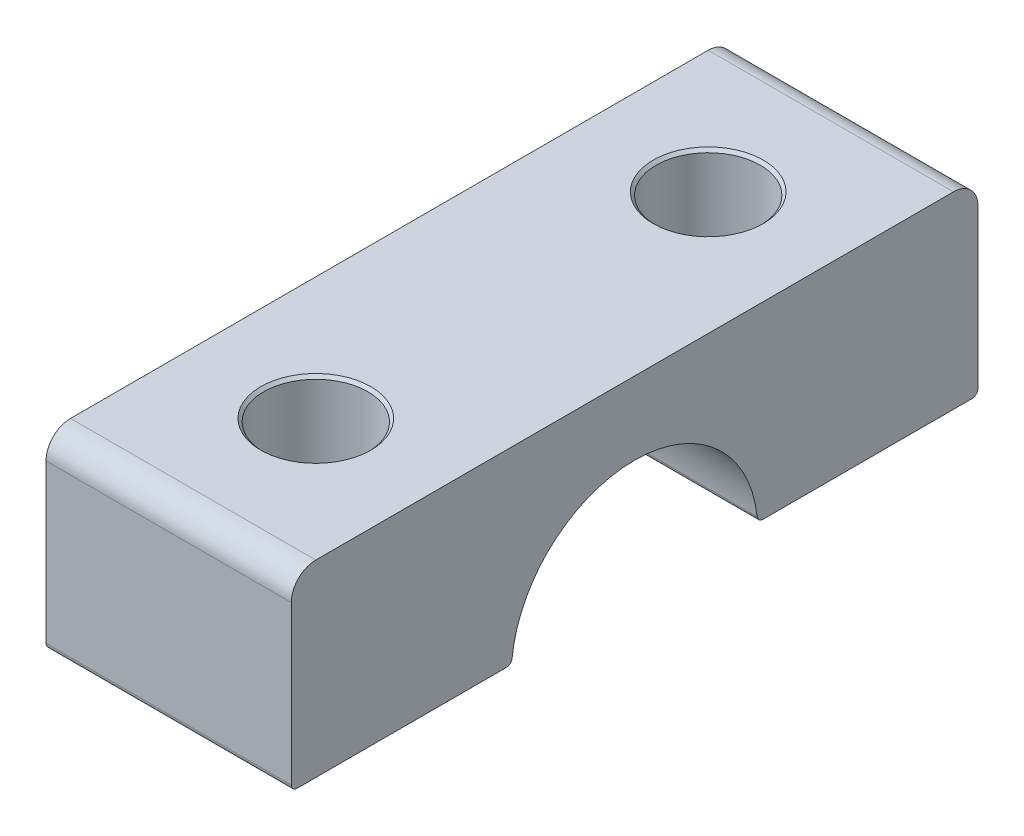
ISO-10303-21;
HEADER;
FILE_DESCRIPTION(('STEP AP214'),'2;1');
FILE_NAME('part.step','',(''),(''),'','','');
FILE_SCHEMA(('AUTOMOTIVE_DESIGN { 1 0 10303 214 1 1 1 1 }'));
ENDSEC;
DATA;
#1=APPLICATION_CONTEXT('core data for automotive mechanical design processes');
#2=APPLICATION_PROTOCOL_DEFINITION('international standard','automotive_design',2000,#1);
#3=PRODUCT_CONTEXT('',#1,'mechanical');
#4=PRODUCT('Part','Part','',(#3));
#5=PRODUCT_RELATED_PRODUCT_CATEGORY('part','',(#4));
#6=PRODUCT_DEFINITION_FORMATION('','',#4);
#7=PRODUCT_DEFINITION_CONTEXT('part definition',#1,'design');
#8=PRODUCT_DEFINITION('design','',#6,#7);
#9=PRODUCT_DEFINITION_SHAPE('','',#8);
#10=(LENGTH_UNIT() NAMED_UNIT(*) SI_UNIT(.MILLI.,.METRE.));
#11=(NAMED_UNIT(*) PLANE_ANGLE_UNIT() SI_UNIT($,.RADIAN.));
#12=(NAMED_UNIT(*) SI_UNIT($,.STERADIAN.) SOLID_ANGLE_UNIT());
#13=UNCERTAINTY_MEASURE_WITH_UNIT(LENGTH_MEASURE(1.E-05),#10,'distance_accuracy_value','');
#14=(GEOMETRIC_REPRESENTATION_CONTEXT(3) GLOBAL_UNCERTAINTY_ASSIGNED_CONTEXT((#13)) GLOBAL_UNIT_ASSIGNED_CONTEXT((#10,
#11,#12)) REPRESENTATION_CONTEXT('',''));
#15=CARTESIAN_POINT('',(0.,0.,0.));
#16=DIRECTION('',(0.,0.,1.));
#17=DIRECTION('',(1.,0.,0.));
#18=AXIS2_PLACEMENT_3D('',#15,#16,#17);
#19=CARTESIAN_POINT('',(15.875,22.225,-41.275));
#20=DIRECTION('',(-1.,0.,0.));
#21=DIRECTION('',(0.,0.,1.));
#22=AXIS2_PLACEMENT_3D('',#19,#20,#21);
#23=CYLINDRICAL_SURFACE('',#22,3.175);
#24=CARTESIAN_POINT('',(-15.875,22.225,-41.275));
#25=DIRECTION('',(1.,0.,0.));
#26=DIRECTION('',(0.,0.,1.));
#27=AXIS2_PLACEMENT_3D('',#24,#25,#26);
#28=CIRCLE('',#27,3.175);
#29=CARTESIAN_POINT('',(-15.875,22.225,-44.45));
#30=VERTEX_POINT('',#29);
#31=CARTESIAN_POINT('',(-15.875,25.4,-41.275));
#32=VERTEX_POINT('',#31);
#33=EDGE_CURVE('E127',#30,#32,#28,.T.);
#34=ORIENTED_EDGE('',*,*,#33,.T.);
#35=DIRECTION('',(-1.,0.,0.));
#36=VECTOR('',#35,1.);
#37=CARTESIAN_POINT('',(15.875,25.4,-41.275));
#38=LINE('',#37,#36);
#39=CARTESIAN_POINT('',(15.875,25.4,-41.275));
#40=VERTEX_POINT('',#39);
#41=EDGE_CURVE('E135',#40,#32,#38,.T.);
#42=ORIENTED_EDGE('',*,*,#41,.F.);
#43=CARTESIAN_POINT('',(15.875,22.225,-41.275));
#44=DIRECTION('',(1.,0.,0.));
#45=DIRECTION('',(0.,0.,1.));
#46=AXIS2_PLACEMENT_3D('',#43,#44,#45);
#47=CIRCLE('',#46,3.175);
#48=CARTESIAN_POINT('',(15.875,22.225,-44.45));
#49=VERTEX_POINT('',#48);
#50=EDGE_CURVE('E166',#49,#40,#47,.T.);
#51=ORIENTED_EDGE('',*,*,#50,.F.);
#52=DIRECTION('',(-1.,0.,0.));
#53=VECTOR('',#52,1.);
#54=CARTESIAN_POINT('',(15.875,22.225,-44.45));
#55=LINE('',#54,#53);
#56=EDGE_CURVE('E144',#49,#30,#55,.T.);
#57=ORIENTED_EDGE('',*,*,#56,.T.);
#58=EDGE_LOOP('',(#34,#42,#51,#57));
#59=FACE_BOUND('',#58,.T.);
#60=ADVANCED_FACE('F34',(#59),#23,.T.);
#61=CARTESIAN_POINT('',(15.875,25.4,41.275));
#62=DIRECTION('',(0.,-1.,0.));
#63=DIRECTION('',(0.,0.,-1.));
#64=AXIS2_PLACEMENT_3D('',#61,#62,#63);
#65=PLANE('',#64);
#66=CARTESIAN_POINT('',(0.,25.4,-25.4));
#67=DIRECTION('',(0.,-1.,0.));
#68=DIRECTION('',(0.,0.,-1.));
#69=AXIS2_PLACEMENT_3D('',#66,#67,#68);
#70=CIRCLE('',#69,7.12787500000001);
#71=CARTESIAN_POINT('',(0.,25.4,-18.272125));
#72=VERTEX_POINT('',#71);
#73=EDGE_CURVE('E224',#72,#72,#70,.T.);
#74=ORIENTED_EDGE('',*,*,#73,.T.);
#75=EDGE_LOOP('',(#74));
#76=FACE_BOUND('',#75,.T.);
#77=CARTESIAN_POINT('',(0.,25.4,25.4));
#78=DIRECTION('',(0.,-1.,0.));
#79=DIRECTION('',(0.,0.,-1.));
#80=AXIS2_PLACEMENT_3D('',#77,#78,#79);
#81=CIRCLE('',#80,7.127875);
#82=CARTESIAN_POINT('',(0.,25.4,18.272125));
#83=VERTEX_POINT('',#82);
#84=EDGE_CURVE('E221',#83,#83,#81,.T.);
#85=ORIENTED_EDGE('',*,*,#84,.T.);
#86=EDGE_LOOP('',(#85));
#87=FACE_BOUND('',#86,.T.);
#88=DIRECTION('',(0.,0.,1.));
#89=VECTOR('',#88,1.);
#90=CARTESIAN_POINT('',(-15.875,25.4,41.275));
#91=LINE('',#90,#89);
#92=CARTESIAN_POINT('',(-15.875,25.4,41.275));
#93=VERTEX_POINT('',#92);
#94=EDGE_CURVE('E122',#32,#93,#91,.T.);
#95=ORIENTED_EDGE('',*,*,#94,.T.);
#96=DIRECTION('',(-1.,0.,0.));
#97=VECTOR('',#96,1.);
#98=CARTESIAN_POINT('',(15.875,25.4,41.275));
#99=LINE('',#98,#97);
#100=CARTESIAN_POINT('',(15.875,25.4,41.275));
#101=VERTEX_POINT('',#100);
#102=EDGE_CURVE('E141',#101,#93,#99,.T.);
#103=ORIENTED_EDGE('',*,*,#102,.F.);
#104=DIRECTION('',(0.,0.,1.));
#105=VECTOR('',#104,1.);
#106=CARTESIAN_POINT('',(15.875,25.4,41.275));
#107=LINE('',#106,#105);
#108=EDGE_CURVE('E137',#40,#101,#107,.T.);
#109=ORIENTED_EDGE('',*,*,#108,.F.);
#110=ORIENTED_EDGE('',*,*,#41,.T.);
#111=EDGE_LOOP('',(#95,#103,#109,#110));
#112=FACE_BOUND('',#111,.T.);
#113=ADVANCED_FACE('F136',(#76,#87,#112),#65,.F.);
#114=CARTESIAN_POINT('',(15.875,22.225,41.275));
#115=DIRECTION('',(-1.,0.,0.));
#116=DIRECTION('',(0.,0.,1.));
#117=AXIS2_PLACEMENT_3D('',#114,#115,#116);
#118=CYLINDRICAL_SURFACE('',#117,3.175);
#119=CARTESIAN_POINT('',(-15.875,22.225,41.275));
#120=DIRECTION('',(1.,0.,0.));
#121=DIRECTION('',(0.,0.,-1.));
#122=AXIS2_PLACEMENT_3D('',#119,#120,#121);
#123=CIRCLE('',#122,3.175);
#124=CARTESIAN_POINT('',(-15.875,22.225,44.45));
#125=VERTEX_POINT('',#124);
#126=EDGE_CURVE('E129',#93,#125,#123,.T.);
#127=ORIENTED_EDGE('',*,*,#126,.T.);
#128=DIRECTION('',(-1.,0.,0.));
#129=VECTOR('',#128,1.);
#130=CARTESIAN_POINT('',(15.875,22.225,44.45));
#131=LINE('',#130,#129);
#132=CARTESIAN_POINT('',(15.875,22.225,44.45));
#133=VERTEX_POINT('',#132);
#134=EDGE_CURVE('E212',#133,#125,#131,.T.);
#135=ORIENTED_EDGE('',*,*,#134,.F.);
#136=CARTESIAN_POINT('',(15.875,22.225,41.275));
#137=DIRECTION('',(1.,0.,0.));
#138=DIRECTION('',(0.,0.,-1.));
#139=AXIS2_PLACEMENT_3D('',#136,#137,#138);
#140=CIRCLE('',#139,3.175);
#141=EDGE_CURVE('E169',#101,#133,#140,.T.);
#142=ORIENTED_EDGE('',*,*,#141,.F.);
#143=ORIENTED_EDGE('',*,*,#102,.T.);
#144=EDGE_LOOP('',(#127,#135,#142,#143));
#145=FACE_BOUND('',#144,.T.);
#146=ADVANCED_FACE('F258',(#145),#118,.T.);
#147=CARTESIAN_POINT('',(15.875,22.225,44.45));
#148=DIRECTION('',(0.,0.,-1.));
#149=DIRECTION('',(0.,1.,0.));
#150=AXIS2_PLACEMENT_3D('',#147,#148,#149);
#151=PLANE('',#150);
#152=DIRECTION('',(0.,-1.,0.));
#153=VECTOR('',#152,1.);
#154=CARTESIAN_POINT('',(-15.875,22.225,44.45));
#155=LINE('',#154,#153);
#156=CARTESIAN_POINT('',(-15.875,1.77800000000001,44.45));
#157=VERTEX_POINT('',#156);
#158=EDGE_CURVE('E148',#125,#157,#155,.T.);
#159=ORIENTED_EDGE('',*,*,#158,.T.);
#160=DIRECTION('',(-1.,0.,0.));
#161=VECTOR('',#160,1.);
#162=CARTESIAN_POINT('',(15.875,1.77800000000001,44.45));
#163=LINE('',#162,#161);
#164=CARTESIAN_POINT('',(15.875,1.77800000000001,44.45));
#165=VERTEX_POINT('',#164);
#166=EDGE_CURVE('E209',#165,#157,#163,.T.);
#167=ORIENTED_EDGE('',*,*,#166,.F.);
#168=DIRECTION('',(0.,-1.,0.));
#169=VECTOR('',#168,1.);
#170=CARTESIAN_POINT('',(15.875,22.225,44.45));
#171=LINE('',#170,#169);
#172=EDGE_CURVE('E171',#133,#165,#171,.T.);
#173=ORIENTED_EDGE('',*,*,#172,.F.);
#174=ORIENTED_EDGE('',*,*,#134,.T.);
#175=EDGE_LOOP('',(#159,#167,#173,#174));
#176=FACE_BOUND('',#175,.T.);
#177=ADVANCED_FACE('F263',(#176),#151,.F.);
#178=CARTESIAN_POINT('',(15.875,1.778,43.688));
#179=DIRECTION('',(-1.,0.,0.));
#180=DIRECTION('',(0.,0.,1.));
#181=AXIS2_PLACEMENT_3D('',#178,#179,#180);
#182=CYLINDRICAL_SURFACE('',#181,0.761999999999999);
#183=CARTESIAN_POINT('',(-15.875,1.778,43.688));
#184=DIRECTION('',(1.,0.,0.));
#185=DIRECTION('',(0.,0.,-1.));
#186=AXIS2_PLACEMENT_3D('',#183,#184,#185);
#187=CIRCLE('',#186,0.761999999999999);
#188=CARTESIAN_POINT('',(-15.875,1.016,43.688));
#189=VERTEX_POINT('',#188);
#190=EDGE_CURVE('E150',#157,#189,#187,.T.);
#191=ORIENTED_EDGE('',*,*,#190,.T.);
#192=DIRECTION('',(-1.,0.,0.));
#193=VECTOR('',#192,1.);
#194=CARTESIAN_POINT('',(15.875,1.016,43.688));
#195=LINE('',#194,#193);
#196=CARTESIAN_POINT('',(15.875,1.016,43.688));
#197=VERTEX_POINT('',#196);
#198=EDGE_CURVE('E206',#197,#189,#195,.T.);
#199=ORIENTED_EDGE('',*,*,#198,.F.);
#200=CARTESIAN_POINT('',(15.875,1.778,43.688));
#201=DIRECTION('',(1.,0.,0.));
#202=DIRECTION('',(0.,0.,-1.));
#203=AXIS2_PLACEMENT_3D('',#200,#201,#202);
#204=CIRCLE('',#203,0.761999999999999);
#205=EDGE_CURVE('E173',#165,#197,#204,.T.);
#206=ORIENTED_EDGE('',*,*,#205,.F.);
#207=ORIENTED_EDGE('',*,*,#166,.T.);
#208=EDGE_LOOP('',(#191,#199,#206,#207));
#209=FACE_BOUND('',#208,.T.);
#210=ADVANCED_FACE('F270',(#209),#182,.T.);
#211=CARTESIAN_POINT('',(15.875,1.016,43.688));
#212=DIRECTION('',(0.,1.,0.));
#213=DIRECTION('',(0.,0.,1.));
#214=AXIS2_PLACEMENT_3D('',#211,#212,#213);
#215=PLANE('',#214);
#216=CARTESIAN_POINT('',(0.,1.016,25.4));
#217=DIRECTION('',(0.,1.,0.));
#218=DIRECTION('',(0.,0.,1.));
#219=AXIS2_PLACEMENT_3D('',#216,#217,#218);
#220=CIRCLE('',#219,7.12787499999999);
#221=CARTESIAN_POINT('',(0.,1.016,18.272125));
#222=VERTEX_POINT('',#221);
#223=EDGE_CURVE('E11',#222,#222,#220,.T.);
#224=ORIENTED_EDGE('',*,*,#223,.T.);
#225=EDGE_LOOP('',(#224));
#226=FACE_BOUND('',#225,.T.);
#227=DIRECTION('',(0.,0.,-1.));
#228=VECTOR('',#227,1.);
#229=CARTESIAN_POINT('',(-15.875,1.016,43.688));
#230=LINE('',#229,#228);
#231=CARTESIAN_POINT('',(-15.875,1.016,16.6183564241474));
#232=VERTEX_POINT('',#231);
#233=EDGE_CURVE('E152',#189,#232,#230,.T.);
#234=ORIENTED_EDGE('',*,*,#233,.T.);
#235=DIRECTION('',(-1.,0.,0.));
#236=VECTOR('',#235,1.);
#237=CARTESIAN_POINT('',(15.875,1.016,16.6183564241474));
#238=LINE('',#237,#236);
#239=CARTESIAN_POINT('',(15.875,1.016,16.6183564241474));
#240=VERTEX_POINT('',#239);
#241=EDGE_CURVE('E203',#240,#232,#238,.T.);
#242=ORIENTED_EDGE('',*,*,#241,.F.);
#243=DIRECTION('',(0.,0.,-1.));
#244=VECTOR('',#243,1.);
#245=CARTESIAN_POINT('',(15.875,1.016,43.688));
#246=LINE('',#245,#244);
#247=EDGE_CURVE('E175',#197,#240,#246,.T.);
#248=ORIENTED_EDGE('',*,*,#247,.F.);
#249=ORIENTED_EDGE('',*,*,#198,.T.);
#250=EDGE_LOOP('',(#234,#242,#248,#249));
#251=FACE_BOUND('',#250,.T.);
#252=ADVANCED_FACE('F274',(#226,#251),#215,.F.);
#253=CARTESIAN_POINT('',(15.875,1.778,16.6183564241474));
#254=DIRECTION('',(-1.,0.,0.));
#255=DIRECTION('',(0.,0.,1.));
#256=AXIS2_PLACEMENT_3D('',#253,#254,#255);
#257=CYLINDRICAL_SURFACE('',#256,0.762000000000002);
#258=CARTESIAN_POINT('',(-15.875,1.778,16.6183564241474));
#259=DIRECTION('',(1.,0.,0.));
#260=DIRECTION('',(0.,0.,-1.));
#261=AXIS2_PLACEMENT_3D('',#258,#259,#260);
#262=CIRCLE('',#261,0.762000000000002);
#263=CARTESIAN_POINT('',(-15.875,1.69693617021277,15.8606805993382));
#264=VERTEX_POINT('',#263);
#265=EDGE_CURVE('E154',#232,#264,#262,.T.);
#266=ORIENTED_EDGE('',*,*,#265,.T.);
#267=DIRECTION('',(-1.,0.,0.));
#268=VECTOR('',#267,1.);
#269=CARTESIAN_POINT('',(15.875,1.69693617021277,15.8606805993382));
#270=LINE('',#269,#268);
#271=CARTESIAN_POINT('',(15.875,1.69693617021277,15.8606805993382));
#272=VERTEX_POINT('',#271);
#273=EDGE_CURVE('E200',#272,#264,#270,.T.);
#274=ORIENTED_EDGE('',*,*,#273,.F.);
#275=CARTESIAN_POINT('',(15.875,1.778,16.6183564241474));
#276=DIRECTION('',(1.,0.,0.));
#277=DIRECTION('',(0.,0.,-1.));
#278=AXIS2_PLACEMENT_3D('',#275,#276,#277);
#279=CIRCLE('',#278,0.762000000000002);
#280=EDGE_CURVE('E177',#240,#272,#279,.T.);
#281=ORIENTED_EDGE('',*,*,#280,.F.);
#282=ORIENTED_EDGE('',*,*,#241,.T.);
#283=EDGE_LOOP('',(#266,#274,#281,#282));
#284=FACE_BOUND('',#283,.T.);
#285=ADVANCED_FACE('F278',(#284),#257,.T.);
#286=CARTESIAN_POINT('',(15.875,0.,0.));
#287=DIRECTION('',(-1.,0.,0.));
#288=DIRECTION('',(0.,0.,1.));
#289=AXIS2_PLACEMENT_3D('',#286,#287,#288);
#290=CYLINDRICAL_SURFACE('',#289,15.9512);
#291=CARTESIAN_POINT('',(-15.875,0.,0.));
#292=DIRECTION('',(-1.,0.,0.));
#293=DIRECTION('',(0.,0.,-1.));
#294=AXIS2_PLACEMENT_3D('',#291,#292,#293);
#295=CIRCLE('',#294,15.9512);
#296=CARTESIAN_POINT('',(-15.875,1.69693617021277,-15.8606805993382));
#297=VERTEX_POINT('',#296);
#298=EDGE_CURVE('E156',#264,#297,#295,.T.);
#299=ORIENTED_EDGE('',*,*,#298,.T.);
#300=DIRECTION('',(-1.,0.,0.));
#301=VECTOR('',#300,1.);
#302=CARTESIAN_POINT('',(15.875,1.69693617021277,-15.8606805993382));
#303=LINE('',#302,#301);
#304=CARTESIAN_POINT('',(15.875,1.69693617021277,-15.8606805993382));
#305=VERTEX_POINT('',#304);
#306=EDGE_CURVE('E197',#305,#297,#303,.T.);
#307=ORIENTED_EDGE('',*,*,#306,.F.);
#308=CARTESIAN_POINT('',(15.875,0.,0.));
#309=DIRECTION('',(-1.,0.,0.));
#310=DIRECTION('',(0.,0.,-1.));
#311=AXIS2_PLACEMENT_3D('',#308,#309,#310);
#312=CIRCLE('',#311,15.9512);
#313=EDGE_CURVE('E179',#272,#305,#312,.T.);
#314=ORIENTED_EDGE('',*,*,#313,.F.);
#315=ORIENTED_EDGE('',*,*,#273,.T.);
#316=EDGE_LOOP('',(#299,#307,#314,#315));
#317=FACE_BOUND('',#316,.T.);
#318=ADVANCED_FACE('F282',(#317),#290,.F.);
#319=CARTESIAN_POINT('',(15.875,1.778,-16.6183564241474));
#320=DIRECTION('',(-1.,0.,0.));
#321=DIRECTION('',(0.,0.,1.));
#322=AXIS2_PLACEMENT_3D('',#319,#320,#321);
#323=CYLINDRICAL_SURFACE('',#322,0.762000000000002);
#324=CARTESIAN_POINT('',(-15.875,1.778,-16.6183564241474));
#325=DIRECTION('',(1.,0.,0.));
#326=DIRECTION('',(0.,0.,1.));
#327=AXIS2_PLACEMENT_3D('',#324,#325,#326);
#328=CIRCLE('',#327,0.762000000000002);
#329=CARTESIAN_POINT('',(-15.875,1.016,-16.6183564241474));
#330=VERTEX_POINT('',#329);
#331=EDGE_CURVE('E158',#297,#330,#328,.T.);
#332=ORIENTED_EDGE('',*,*,#331,.T.);
#333=DIRECTION('',(-1.,0.,0.));
#334=VECTOR('',#333,1.);
#335=CARTESIAN_POINT('',(15.875,1.016,-16.6183564241474));
#336=LINE('',#335,#334);
#337=CARTESIAN_POINT('',(15.875,1.016,-16.6183564241474));
#338=VERTEX_POINT('',#337);
#339=EDGE_CURVE('E194',#338,#330,#336,.T.);
#340=ORIENTED_EDGE('',*,*,#339,.F.);
#341=CARTESIAN_POINT('',(15.875,1.778,-16.6183564241474));
#342=DIRECTION('',(1.,0.,0.));
#343=DIRECTION('',(0.,0.,1.));
#344=AXIS2_PLACEMENT_3D('',#341,#342,#343);
#345=CIRCLE('',#344,0.762000000000002);
#346=EDGE_CURVE('E181',#305,#338,#345,.T.);
#347=ORIENTED_EDGE('',*,*,#346,.F.);
#348=ORIENTED_EDGE('',*,*,#306,.T.);
#349=EDGE_LOOP('',(#332,#340,#347,#348));
#350=FACE_BOUND('',#349,.T.);
#351=ADVANCED_FACE('F286',(#350),#323,.T.);
#352=CARTESIAN_POINT('',(15.875,1.016,-16.6183564241474));
#353=DIRECTION('',(0.,1.,0.));
#354=DIRECTION('',(0.,0.,1.));
#355=AXIS2_PLACEMENT_3D('',#352,#353,#354);
#356=PLANE('',#355);
#357=CARTESIAN_POINT('',(0.,1.01600000000001,-25.4));
#358=DIRECTION('',(0.,1.,0.));
#359=DIRECTION('',(0.,0.,1.));
#360=AXIS2_PLACEMENT_3D('',#357,#358,#359);
#361=CIRCLE('',#360,7.127875);
#362=CARTESIAN_POINT('',(0.,1.016,-18.272125));
#363=VERTEX_POINT('',#362);
#364=EDGE_CURVE('E227',#363,#363,#361,.T.);
#365=ORIENTED_EDGE('',*,*,#364,.T.);
#366=EDGE_LOOP('',(#365));
#367=FACE_BOUND('',#366,.T.);
#368=DIRECTION('',(0.,0.,-1.));
#369=VECTOR('',#368,1.);
#370=CARTESIAN_POINT('',(-15.875,1.016,-16.6183564241474));
#371=LINE('',#370,#369);
#372=CARTESIAN_POINT('',(-15.875,1.01600000000001,-43.688));
#373=VERTEX_POINT('',#372);
#374=EDGE_CURVE('E160',#330,#373,#371,.T.);
#375=ORIENTED_EDGE('',*,*,#374,.T.);
#376=DIRECTION('',(-1.,0.,0.));
#377=VECTOR('',#376,1.);
#378=CARTESIAN_POINT('',(15.875,1.01600000000001,-43.688));
#379=LINE('',#378,#377);
#380=CARTESIAN_POINT('',(15.875,1.01600000000001,-43.688));
#381=VERTEX_POINT('',#380);
#382=EDGE_CURVE('E191',#381,#373,#379,.T.);
#383=ORIENTED_EDGE('',*,*,#382,.F.);
#384=DIRECTION('',(0.,0.,-1.));
#385=VECTOR('',#384,1.);
#386=CARTESIAN_POINT('',(15.875,1.016,-16.6183564241474));
#387=LINE('',#386,#385);
#388=EDGE_CURVE('E183',#338,#381,#387,.T.);
#389=ORIENTED_EDGE('',*,*,#388,.F.);
#390=ORIENTED_EDGE('',*,*,#339,.T.);
#391=EDGE_LOOP('',(#375,#383,#389,#390));
#392=FACE_BOUND('',#391,.T.);
#393=ADVANCED_FACE('F290',(#367,#392),#356,.F.);
#394=CARTESIAN_POINT('',(15.875,1.77800000000001,-43.688));
#395=DIRECTION('',(-1.,0.,0.));
#396=DIRECTION('',(0.,0.,1.));
#397=AXIS2_PLACEMENT_3D('',#394,#395,#396);
#398=CYLINDRICAL_SURFACE('',#397,0.761999999999999);
#399=CARTESIAN_POINT('',(-15.875,1.77800000000001,-43.688));
#400=DIRECTION('',(1.,0.,0.));
#401=DIRECTION('',(0.,0.,-1.));
#402=AXIS2_PLACEMENT_3D('',#399,#400,#401);
#403=CIRCLE('',#402,0.761999999999999);
#404=CARTESIAN_POINT('',(-15.875,1.77800000000002,-44.45));
#405=VERTEX_POINT('',#404);
#406=EDGE_CURVE('E162',#373,#405,#403,.T.);
#407=ORIENTED_EDGE('',*,*,#406,.T.);
#408=DIRECTION('',(-1.,0.,0.));
#409=VECTOR('',#408,1.);
#410=CARTESIAN_POINT('',(15.875,1.77800000000002,-44.45));
#411=LINE('',#410,#409);
#412=CARTESIAN_POINT('',(15.875,1.77800000000002,-44.45));
#413=VERTEX_POINT('',#412);
#414=EDGE_CURVE('E188',#413,#405,#411,.T.);
#415=ORIENTED_EDGE('',*,*,#414,.F.);
#416=CARTESIAN_POINT('',(15.875,1.77800000000001,-43.688));
#417=DIRECTION('',(1.,0.,0.));
#418=DIRECTION('',(0.,0.,-1.));
#419=AXIS2_PLACEMENT_3D('',#416,#417,#418);
#420=CIRCLE('',#419,0.761999999999999);
#421=EDGE_CURVE('E53',#381,#413,#420,.T.);
#422=ORIENTED_EDGE('',*,*,#421,.F.);
#423=ORIENTED_EDGE('',*,*,#382,.T.);
#424=EDGE_LOOP('',(#407,#415,#422,#423));
#425=FACE_BOUND('',#424,.T.);
#426=ADVANCED_FACE('F294',(#425),#398,.T.);
#427=CARTESIAN_POINT('',(15.875,22.225,-44.45));
#428=DIRECTION('',(0.,0.,1.));
#429=DIRECTION('',(0.,-1.,0.));
#430=AXIS2_PLACEMENT_3D('',#427,#428,#429);
#431=PLANE('',#430);
#432=DIRECTION('',(0.,1.,0.));
#433=VECTOR('',#432,1.);
#434=CARTESIAN_POINT('',(-15.875,22.225,-44.45));
#435=LINE('',#434,#433);
#436=EDGE_CURVE('E164',#405,#30,#435,.T.);
#437=ORIENTED_EDGE('',*,*,#436,.T.);
#438=ORIENTED_EDGE('',*,*,#56,.F.);
#439=DIRECTION('',(0.,1.,0.));
#440=VECTOR('',#439,1.);
#441=CARTESIAN_POINT('',(15.875,22.225,-44.45));
#442=LINE('',#441,#440);
#443=EDGE_CURVE('E48',#413,#49,#442,.T.);
#444=ORIENTED_EDGE('',*,*,#443,.F.);
#445=ORIENTED_EDGE('',*,*,#414,.T.);
#446=EDGE_LOOP('',(#437,#438,#444,#445));
#447=FACE_BOUND('',#446,.T.);
#448=ADVANCED_FACE('F298',(#447),#431,.F.);
#449=CARTESIAN_POINT('',(15.875,22.225,-41.275));
#450=DIRECTION('',(-1.,0.,0.));
#451=DIRECTION('',(0.,0.,1.));
#452=AXIS2_PLACEMENT_3D('',#449,#450,#451);
#453=PLANE('',#452);
#454=ORIENTED_EDGE('',*,*,#50,.T.);
#455=ORIENTED_EDGE('',*,*,#108,.T.);
#456=ORIENTED_EDGE('',*,*,#141,.T.);
#457=ORIENTED_EDGE('',*,*,#172,.T.);
#458=ORIENTED_EDGE('',*,*,#205,.T.);
#459=ORIENTED_EDGE('',*,*,#247,.T.);
#460=ORIENTED_EDGE('',*,*,#280,.T.);
#461=ORIENTED_EDGE('',*,*,#313,.T.);
#462=ORIENTED_EDGE('',*,*,#346,.T.);
#463=ORIENTED_EDGE('',*,*,#388,.T.);
#464=ORIENTED_EDGE('',*,*,#421,.T.);
#465=ORIENTED_EDGE('',*,*,#443,.T.);
#466=EDGE_LOOP('',(#454,#455,#456,#457,#458,#459,#460,#461,#462,#463,#464,#465));
#467=FACE_BOUND('',#466,.T.);
#468=ADVANCED_FACE('F302',(#467),#453,.F.);
#469=CARTESIAN_POINT('',(-15.875,22.225,-41.275));
#470=DIRECTION('',(-1.,0.,0.));
#471=DIRECTION('',(0.,0.,1.));
#472=AXIS2_PLACEMENT_3D('',#469,#470,#471);
#473=PLANE('',#472);
#474=ORIENTED_EDGE('',*,*,#33,.F.);
#475=ORIENTED_EDGE('',*,*,#436,.F.);
#476=ORIENTED_EDGE('',*,*,#406,.F.);
#477=ORIENTED_EDGE('',*,*,#374,.F.);
#478=ORIENTED_EDGE('',*,*,#331,.F.);
#479=ORIENTED_EDGE('',*,*,#298,.F.);
#480=ORIENTED_EDGE('',*,*,#265,.F.);
#481=ORIENTED_EDGE('',*,*,#233,.F.);
#482=ORIENTED_EDGE('',*,*,#190,.F.);
#483=ORIENTED_EDGE('',*,*,#158,.F.);
#484=ORIENTED_EDGE('',*,*,#126,.F.);
#485=ORIENTED_EDGE('',*,*,#94,.F.);
#486=EDGE_LOOP('',(#474,#475,#476,#477,#478,#479,#480,#481,#482,#483,#484,#485));
#487=FACE_BOUND('',#486,.T.);
#488=ADVANCED_FACE('F124',(#487),#473,.T.);
#489=CARTESIAN_POINT('',(0.,1.01599999999999,25.4));
#490=DIRECTION('',(0.,1.,0.));
#491=DIRECTION('',(0.,0.,1.));
#492=AXIS2_PLACEMENT_3D('',#489,#490,#491);
#493=CYLINDRICAL_SURFACE('',#492,6.746875);
#494=CARTESIAN_POINT('',(0.,25.019,25.4));
#495=DIRECTION('',(0.,-1.,0.));
#496=DIRECTION('',(0.,0.,-1.));
#497=AXIS2_PLACEMENT_3D('',#494,#495,#496);
#498=CIRCLE('',#497,6.746875);
#499=CARTESIAN_POINT('',(0.,25.019,18.653125));
#500=VERTEX_POINT('',#499);
#501=EDGE_CURVE('E41',#500,#500,#498,.F.);
#502=ORIENTED_EDGE('',*,*,#501,.T.);
#503=EDGE_LOOP('',(#502));
#504=FACE_BOUND('',#503,.T.);
#505=CARTESIAN_POINT('',(0.,1.39699999999999,25.4));
#506=DIRECTION('',(0.,1.,0.));
#507=DIRECTION('',(0.,0.,1.));
#508=AXIS2_PLACEMENT_3D('',#505,#506,#507);
#509=CIRCLE('',#508,6.746875);
#510=CARTESIAN_POINT('',(0.,1.39699999999999,18.653125));
#511=VERTEX_POINT('',#510);
#512=EDGE_CURVE('E230',#511,#511,#509,.F.);
#513=ORIENTED_EDGE('',*,*,#512,.T.);
#514=EDGE_LOOP('',(#513));
#515=FACE_BOUND('',#514,.T.);
#516=ADVANCED_FACE('F235',(#504,#515),#493,.F.);
#517=CARTESIAN_POINT('',(0.,1.016,-25.4));
#518=DIRECTION('',(0.,1.,0.));
#519=DIRECTION('',(0.,0.,1.));
#520=AXIS2_PLACEMENT_3D('',#517,#518,#519);
#521=CYLINDRICAL_SURFACE('',#520,6.746875);
#522=CARTESIAN_POINT('',(0.,25.019,-25.4));
#523=DIRECTION('',(0.,-1.,0.));
#524=DIRECTION('',(0.,0.,-1.));
#525=AXIS2_PLACEMENT_3D('',#522,#523,#524);
#526=CIRCLE('',#525,6.746875);
#527=CARTESIAN_POINT('',(0.,25.019,-18.653125));
#528=VERTEX_POINT('',#527);
#529=EDGE_CURVE('E218',#528,#528,#526,.F.);
#530=ORIENTED_EDGE('',*,*,#529,.T.);
#531=EDGE_LOOP('',(#530));
#532=FACE_BOUND('',#531,.T.);
#533=CARTESIAN_POINT('',(0.,1.397,-25.4));
#534=DIRECTION('',(0.,1.,0.));
#535=DIRECTION('',(0.,0.,1.));
#536=AXIS2_PLACEMENT_3D('',#533,#534,#535);
#537=CIRCLE('',#536,6.746875);
#538=CARTESIAN_POINT('',(0.,1.397,-18.653125));
#539=VERTEX_POINT('',#538);
#540=EDGE_CURVE('E140',#539,#539,#537,.F.);
#541=ORIENTED_EDGE('',*,*,#540,.T.);
#542=EDGE_LOOP('',(#541));
#543=FACE_BOUND('',#542,.T.);
#544=ADVANCED_FACE('F310',(#532,#543),#521,.F.);
#545=CARTESIAN_POINT('',(0.,25.019,-25.4));
#546=DIRECTION('',(0.,1.,0.));
#547=DIRECTION('',(0.,0.,1.));
#548=AXIS2_PLACEMENT_3D('',#545,#546,#547);
#549=CONICAL_SURFACE('',#548,6.746875,0.785398163397452);
#550=CARTESIAN_POINT('',(0.,25.4,-18.272125));
#551=CARTESIAN_POINT('',(0.,25.39603125,-18.27609375));
#552=CARTESIAN_POINT('',(0.,25.3920625,-18.2800625));
#553=CARTESIAN_POINT('',(0.,25.384125,-18.288));
#554=CARTESIAN_POINT('',(0.,25.38015625,-18.29196875));
#555=CARTESIAN_POINT('',(0.,25.37221875,-18.29990625));
#556=CARTESIAN_POINT('',(0.,25.36825,-18.303875));
#557=CARTESIAN_POINT('',(0.,25.3603125,-18.3118125));
#558=CARTESIAN_POINT('',(0.,25.35634375,-18.31578125));
#559=CARTESIAN_POINT('',(0.,25.34840625,-18.32371875));
#560=CARTESIAN_POINT('',(0.,25.3444375,-18.3276875));
#561=CARTESIAN_POINT('',(0.,25.3365,-18.335625));
#562=CARTESIAN_POINT('',(0.,25.33253125,-18.33959375));
#563=CARTESIAN_POINT('',(0.,25.32459375,-18.34753125));
#564=CARTESIAN_POINT('',(0.,25.320625,-18.3515));
#565=CARTESIAN_POINT('',(0.,25.3126875,-18.3594375));
#566=CARTESIAN_POINT('',(0.,25.30871875,-18.36340625));
#567=CARTESIAN_POINT('',(0.,25.30078125,-18.37134375));
#568=CARTESIAN_POINT('',(0.,25.2968125,-18.3753125));
#569=CARTESIAN_POINT('',(0.,25.288875,-18.38325));
#570=CARTESIAN_POINT('',(0.,25.28490625,-18.38721875));
#571=CARTESIAN_POINT('',(0.,25.27696875,-18.39515625));
#572=CARTESIAN_POINT('',(0.,25.273,-18.399125));
#573=CARTESIAN_POINT('',(0.,25.2650625,-18.4070625));
#574=CARTESIAN_POINT('',(0.,25.26109375,-18.41103125));
#575=CARTESIAN_POINT('',(0.,25.25315625,-18.41896875));
#576=CARTESIAN_POINT('',(0.,25.2491875,-18.4229375));
#577=CARTESIAN_POINT('',(0.,25.24125,-18.430875));
#578=CARTESIAN_POINT('',(0.,25.23728125,-18.43484375));
#579=CARTESIAN_POINT('',(0.,25.22934375,-18.44278125));
#580=CARTESIAN_POINT('',(0.,25.225375,-18.44675));
#581=CARTESIAN_POINT('',(0.,25.2174375,-18.4546875));
#582=CARTESIAN_POINT('',(0.,25.21346875,-18.45865625));
#583=CARTESIAN_POINT('',(0.,25.20553125,-18.46659375));
#584=CARTESIAN_POINT('',(0.,25.2015625,-18.4705625));
#585=CARTESIAN_POINT('',(0.,25.193625,-18.4785));
#586=CARTESIAN_POINT('',(0.,25.18965625,-18.48246875));
#587=CARTESIAN_POINT('',(0.,25.18171875,-18.49040625));
#588=CARTESIAN_POINT('',(0.,25.17775,-18.494375));
#589=CARTESIAN_POINT('',(0.,25.1698125,-18.5023125));
#590=CARTESIAN_POINT('',(0.,25.16584375,-18.50628125));
#591=CARTESIAN_POINT('',(0.,25.15790625,-18.51421875));
#592=CARTESIAN_POINT('',(0.,25.1539375,-18.5181875));
#593=CARTESIAN_POINT('',(0.,25.146,-18.526125));
#594=CARTESIAN_POINT('',(0.,25.14203125,-18.53009375));
#595=CARTESIAN_POINT('',(0.,25.13409375,-18.53803125));
#596=CARTESIAN_POINT('',(0.,25.130125,-18.542));
#597=CARTESIAN_POINT('',(0.,25.1221875,-18.5499375));
#598=CARTESIAN_POINT('',(0.,25.11821875,-18.55390625));
#599=CARTESIAN_POINT('',(0.,25.11028125,-18.56184375));
#600=CARTESIAN_POINT('',(0.,25.1063125,-18.5658125));
#601=CARTESIAN_POINT('',(0.,25.098375,-18.57375));
#602=CARTESIAN_POINT('',(0.,25.09440625,-18.57771875));
#603=CARTESIAN_POINT('',(0.,25.08646875,-18.58565625));
#604=CARTESIAN_POINT('',(0.,25.0825,-18.589625));
#605=CARTESIAN_POINT('',(0.,25.0745625,-18.5975625));
#606=CARTESIAN_POINT('',(0.,25.07059375,-18.60153125));
#607=CARTESIAN_POINT('',(0.,25.06265625,-18.60946875));
#608=CARTESIAN_POINT('',(0.,25.0586875,-18.6134375));
#609=CARTESIAN_POINT('',(0.,25.05075,-18.621375));
#610=CARTESIAN_POINT('',(0.,25.04678125,-18.62534375));
#611=CARTESIAN_POINT('',(0.,25.03884375,-18.63328125));
#612=CARTESIAN_POINT('',(0.,25.034875,-18.63725));
#613=CARTESIAN_POINT('',(0.,25.0269375,-18.6451875));
#614=CARTESIAN_POINT('',(0.,25.02296875,-18.64915625));
#615=CARTESIAN_POINT('',(0.,25.019,-18.653125));
#616=B_SPLINE_CURVE_WITH_KNOTS('',3,(#550,#551,#552,#553,#554,#555,#556,#557,#558,#559,#560,
#561,#562,#563,#564,#565,#566,#567,#568,#569,#570,#571,#572,#573,#574,#575,#576,#577,#578,#579,
#580,#581,#582,#583,#584,#585,#586,#587,#588,#589,#590,#591,#592,#593,#594,#595,#596,#597,#598,
#599,#600,#601,#602,#603,#604,#605,#606,#607,#608,#609,#610,#611,#612,#613,#614,#615),
.UNSPECIFIED.,.F.,.F.,(4,2,2,2,2,2,2,2,2,2,2,2,2,2,2,2,2,2,2,2,2,2,2,2,2,2,2,2,2,2,2,2,4),(0.,
0.0168379802270056,0.0336759604540087,0.0505139406810167,0.0673519209080198,0.0841899011350229,
0.101027881362031,0.117865861589034,0.13470384181604,0.151541822043045,0.168379802270048,
0.185217782497051,0.202055762724059,0.218893742951062,0.235731723178068,0.252569703405074,
0.269407683632077,0.286245663859082,0.303083644086088,0.319921624313093,0.336759604540096,
0.353597584767102,0.370435564994105,0.387273545221111,0.404111525448116,0.420949505675122,
0.437787485902125,0.45462546612913,0.471463446356136,0.488301426583139,0.505139406810147,
0.52197738703715,0.538815367264155),.UNSPECIFIED.);
#617=EDGE_CURVE('BSEAM250',#72,#528,#616,.T.);
#618=ORIENTED_EDGE('',*,*,#73,.F.);
#619=ORIENTED_EDGE('',*,*,#529,.F.);
#620=ORIENTED_EDGE('',*,*,#617,.T.);
#621=ORIENTED_EDGE('',*,*,#617,.F.);
#622=EDGE_LOOP('',(#618,#620,#619,#621));
#623=FACE_BOUND('',#622,.T.);
#624=ADVANCED_FACE('F250',(#623),#549,.F.);
#625=CARTESIAN_POINT('',(0.,1.01600000000001,-25.4));
#626=DIRECTION('',(0.,-1.,0.));
#627=DIRECTION('',(0.,0.,-1.));
#628=AXIS2_PLACEMENT_3D('',#625,#626,#627);
#629=CONICAL_SURFACE('',#628,7.12787499999999,0.785398163397451);
#630=ORIENTED_EDGE('',*,*,#540,.F.);
#631=EDGE_LOOP('',(#630));
#632=FACE_BOUND('',#631,.T.);
#633=ORIENTED_EDGE('',*,*,#364,.F.);
#634=EDGE_LOOP('',(#633));
#635=FACE_BOUND('',#634,.T.);
#636=ADVANCED_FACE('F241',(#632,#635),#629,.F.);
#637=CARTESIAN_POINT('',(0.,25.019,25.4));
#638=DIRECTION('',(0.,1.,0.));
#639=DIRECTION('',(0.,0.,1.));
#640=AXIS2_PLACEMENT_3D('',#637,#638,#639);
#641=CONICAL_SURFACE('',#640,6.746875,0.785398163397452);
#642=ORIENTED_EDGE('',*,*,#84,.F.);
#643=EDGE_LOOP('',(#642));
#644=FACE_BOUND('',#643,.T.);
#645=ORIENTED_EDGE('',*,*,#501,.F.);
#646=EDGE_LOOP('',(#645));
#647=FACE_BOUND('',#646,.T.);
#648=ADVANCED_FACE('F238',(#644,#647),#641,.F.);
#649=CARTESIAN_POINT('',(0.,1.016,25.4));
#650=DIRECTION('',(0.,-1.,0.));
#651=DIRECTION('',(0.,0.,-1.));
#652=AXIS2_PLACEMENT_3D('',#649,#650,#651);
#653=CONICAL_SURFACE('',#652,7.12787499999999,0.78539816339745);
#654=CARTESIAN_POINT('',(0.,1.39699999999999,18.653125));
#655=CARTESIAN_POINT('',(0.,1.39303124999999,18.64915625));
#656=CARTESIAN_POINT('',(0.,1.38906249999999,18.6451875));
#657=CARTESIAN_POINT('',(0.,1.38112499999999,18.63725));
#658=CARTESIAN_POINT('',(0.,1.37715624999999,18.63328125));
#659=CARTESIAN_POINT('',(0.,1.36921874999999,18.62534375));
#660=CARTESIAN_POINT('',(0.,1.36524999999999,18.621375));
#661=CARTESIAN_POINT('',(0.,1.35731249999999,18.6134375));
#662=CARTESIAN_POINT('',(0.,1.35334374999999,18.60946875));
#663=CARTESIAN_POINT('',(0.,1.34540624999999,18.60153125));
#664=CARTESIAN_POINT('',(0.,1.34143749999999,18.5975625));
#665=CARTESIAN_POINT('',(0.,1.33349999999999,18.589625));
#666=CARTESIAN_POINT('',(0.,1.32953124999999,18.58565625));
#667=CARTESIAN_POINT('',(0.,1.32159374999999,18.57771875));
#668=CARTESIAN_POINT('',(0.,1.31762499999999,18.57375));
#669=CARTESIAN_POINT('',(0.,1.30968749999999,18.5658125));
#670=CARTESIAN_POINT('',(0.,1.30571874999999,18.56184375));
#671=CARTESIAN_POINT('',(0.,1.29778124999999,18.55390625));
#672=CARTESIAN_POINT('',(0.,1.29381249999999,18.5499375));
#673=CARTESIAN_POINT('',(0.,1.28587499999999,18.542));
#674=CARTESIAN_POINT('',(0.,1.28190624999999,18.53803125));
#675=CARTESIAN_POINT('',(0.,1.27396874999999,18.53009375));
#676=CARTESIAN_POINT('',(0.,1.26999999999999,18.526125));
#677=CARTESIAN_POINT('',(0.,1.26206249999999,18.5181875));
#678=CARTESIAN_POINT('',(0.,1.25809374999999,18.51421875));
#679=CARTESIAN_POINT('',(0.,1.25015624999999,18.50628125));
#680=CARTESIAN_POINT('',(0.,1.24618749999999,18.5023125));
#681=CARTESIAN_POINT('',(0.,1.23824999999999,18.494375));
#682=CARTESIAN_POINT('',(0.,1.23428124999999,18.49040625));
#683=CARTESIAN_POINT('',(0.,1.22634374999999,18.48246875));
#684=CARTESIAN_POINT('',(0.,1.22237499999999,18.4785));
#685=CARTESIAN_POINT('',(0.,1.21443749999999,18.4705625));
#686=CARTESIAN_POINT('',(0.,1.21046874999999,18.46659375));
#687=CARTESIAN_POINT('',(0.,1.20253124999999,18.45865625));
#688=CARTESIAN_POINT('',(0.,1.19856249999999,18.4546875));
#689=CARTESIAN_POINT('',(0.,1.190625,18.44675));
#690=CARTESIAN_POINT('',(0.,1.18665625,18.44278125));
#691=CARTESIAN_POINT('',(0.,1.17871875,18.43484375));
#692=CARTESIAN_POINT('',(0.,1.17475,18.430875));
#693=CARTESIAN_POINT('',(0.,1.1668125,18.4229375));
#694=CARTESIAN_POINT('',(0.,1.16284375,18.41896875));
#695=CARTESIAN_POINT('',(0.,1.15490625,18.41103125));
#696=CARTESIAN_POINT('',(0.,1.1509375,18.4070625));
#697=CARTESIAN_POINT('',(0.,1.143,18.399125));
#698=CARTESIAN_POINT('',(0.,1.13903125,18.39515625));
#699=CARTESIAN_POINT('',(0.,1.13109375,18.38721875));
#700=CARTESIAN_POINT('',(0.,1.127125,18.38325));
#701=CARTESIAN_POINT('',(0.,1.1191875,18.3753125));
#702=CARTESIAN_POINT('',(0.,1.11521875,18.37134375));
#703=CARTESIAN_POINT('',(0.,1.10728125,18.36340625));
#704=CARTESIAN_POINT('',(0.,1.1033125,18.3594375));
#705=CARTESIAN_POINT('',(0.,1.095375,18.3515));
#706=CARTESIAN_POINT('',(0.,1.09140625,18.34753125));
#707=CARTESIAN_POINT('',(0.,1.08346875,18.33959375));
#708=CARTESIAN_POINT('',(0.,1.0795,18.335625));
#709=CARTESIAN_POINT('',(0.,1.0715625,18.3276875));
#710=CARTESIAN_POINT('',(0.,1.06759375,18.32371875));
#711=CARTESIAN_POINT('',(0.,1.05965625,18.31578125));
#712=CARTESIAN_POINT('',(0.,1.0556875,18.3118125));
#713=CARTESIAN_POINT('',(0.,1.04775,18.303875));
#714=CARTESIAN_POINT('',(0.,1.04378125,18.29990625));
#715=CARTESIAN_POINT('',(0.,1.03584375,18.29196875));
#716=CARTESIAN_POINT('',(0.,1.031875,18.288));
#717=CARTESIAN_POINT('',(0.,1.0239375,18.2800625));
#718=CARTESIAN_POINT('',(0.,1.01996875,18.27609375));
#719=CARTESIAN_POINT('',(0.,1.016,18.272125));
#720=B_SPLINE_CURVE_WITH_KNOTS('',3,(#654,#655,#656,#657,#658,#659,#660,#661,#662,#663,#664,
#665,#666,#667,#668,#669,#670,#671,#672,#673,#674,#675,#676,#677,#678,#679,#680,#681,#682,#683,
#684,#685,#686,#687,#688,#689,#690,#691,#692,#693,#694,#695,#696,#697,#698,#699,#700,#701,#702,
#703,#704,#705,#706,#707,#708,#709,#710,#711,#712,#713,#714,#715,#716,#717,#718,#719),
.UNSPECIFIED.,.F.,.F.,(4,2,2,2,2,2,2,2,2,2,2,2,2,2,2,2,2,2,2,2,2,2,2,2,2,2,2,2,2,2,2,2,4),(0.,
0.0168379802270036,0.0336759604540097,0.0505139406810135,0.0673519209080172,0.0841899011350232,
0.101027881362027,0.11786586158903,0.134703841816034,0.151541822043038,0.168379802270044,
0.185217782497048,0.202055762724051,0.218893742951058,0.235731723178061,0.252569703405065,
0.269407683632068,0.286245663859072,0.303083644086078,0.319921624313082,0.336759604540086,
0.353597584767089,0.370435564994095,0.387273545221099,0.404111525448103,0.420949505675106,
0.43778748590211,0.454625466129116,0.47146344635612,0.488301426583124,0.50513940681013,
0.521977387037133,0.538815367264137),.UNSPECIFIED.);
#721=EDGE_CURVE('BSEAM240',#511,#222,#720,.T.);
#722=ORIENTED_EDGE('',*,*,#512,.F.);
#723=ORIENTED_EDGE('',*,*,#223,.F.);
#724=ORIENTED_EDGE('',*,*,#721,.T.);
#725=ORIENTED_EDGE('',*,*,#721,.F.);
#726=EDGE_LOOP('',(#722,#724,#723,#725));
#727=FACE_BOUND('',#726,.T.);
#728=ADVANCED_FACE('F240',(#727),#653,.F.);
#729=CLOSED_SHELL('',(#60,#113,#146,#177,#210,#252,#285,#318,#351,#393,#426,#448,#468,#488,#516,
#544,#624,#636,#648,#728));
#730=MANIFOLD_SOLID_BREP('B2',#729);
#731=ADVANCED_BREP_SHAPE_REPRESENTATION('',(#18,#730),#14);
#732=SHAPE_DEFINITION_REPRESENTATION(#9,#731);
ENDSEC;
END-ISO-10303-21;
